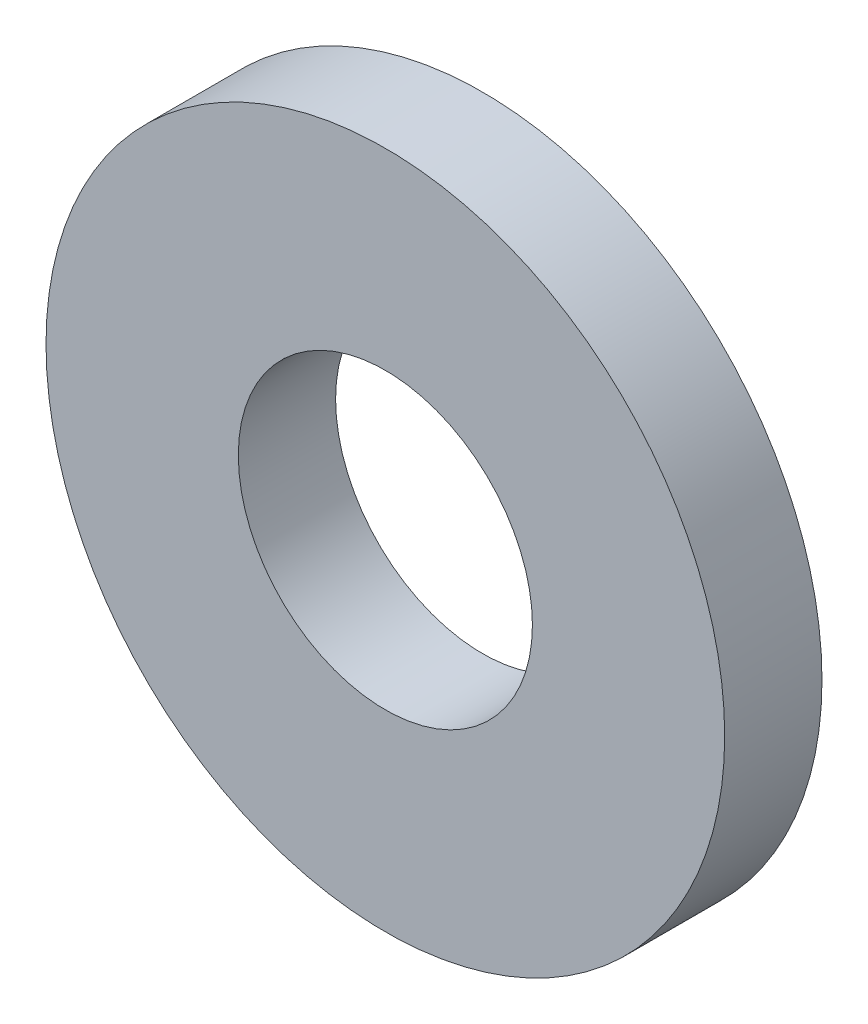
ISO-10303-21;
HEADER;
FILE_DESCRIPTION(('STEP AP214'),'2;1');
FILE_NAME('part.step','',(''),(''),'','','');
FILE_SCHEMA(('AUTOMOTIVE_DESIGN { 1 0 10303 214 1 1 1 1 }'));
ENDSEC;
DATA;
#1=APPLICATION_CONTEXT('core data for automotive mechanical design processes');
#2=APPLICATION_PROTOCOL_DEFINITION('international standard','automotive_design',2000,#1);
#3=PRODUCT_CONTEXT('',#1,'mechanical');
#4=PRODUCT('Part','Part','',(#3));
#5=PRODUCT_RELATED_PRODUCT_CATEGORY('part','',(#4));
#6=PRODUCT_DEFINITION_FORMATION('','',#4);
#7=PRODUCT_DEFINITION_CONTEXT('part definition',#1,'design');
#8=PRODUCT_DEFINITION('design','',#6,#7);
#9=PRODUCT_DEFINITION_SHAPE('','',#8);
#10=(LENGTH_UNIT() NAMED_UNIT(*) SI_UNIT(.MILLI.,.METRE.));
#11=(NAMED_UNIT(*) PLANE_ANGLE_UNIT() SI_UNIT($,.RADIAN.));
#12=(NAMED_UNIT(*) SI_UNIT($,.STERADIAN.) SOLID_ANGLE_UNIT());
#13=UNCERTAINTY_MEASURE_WITH_UNIT(LENGTH_MEASURE(1.E-05),#10,'distance_accuracy_value','');
#14=(GEOMETRIC_REPRESENTATION_CONTEXT(3) GLOBAL_UNCERTAINTY_ASSIGNED_CONTEXT((#13)) GLOBAL_UNIT_ASSIGNED_CONTEXT((#10,
#11,#12)) REPRESENTATION_CONTEXT('',''));
#15=CARTESIAN_POINT('',(0.,0.,0.));
#16=DIRECTION('',(0.,0.,1.));
#17=DIRECTION('',(1.,0.,0.));
#18=AXIS2_PLACEMENT_3D('',#15,#16,#17);
#19=CARTESIAN_POINT('',(0.,0.,1.0922));
#20=DIRECTION('',(0.,0.,1.));
#21=DIRECTION('',(1.,0.,0.));
#22=AXIS2_PLACEMENT_3D('',#19,#20,#21);
#23=PLANE('',#22);
#24=CARTESIAN_POINT('',(0.,0.,1.0922));
#25=DIRECTION('',(0.,0.,1.));
#26=DIRECTION('',(1.,0.,0.));
#27=AXIS2_PLACEMENT_3D('',#24,#25,#26);
#28=CIRCLE('',#27,3.81);
#29=CARTESIAN_POINT('',(3.81,0.,1.0922));
#30=VERTEX_POINT('',#29);
#31=EDGE_CURVE('E10',#30,#30,#28,.T.);
#32=ORIENTED_EDGE('',*,*,#31,.T.);
#33=EDGE_LOOP('',(#32));
#34=FACE_BOUND('',#33,.T.);
#35=CARTESIAN_POINT('',(0.,0.,1.0922));
#36=DIRECTION('',(0.,0.,1.));
#37=DIRECTION('',(1.,0.,0.));
#38=AXIS2_PLACEMENT_3D('',#35,#36,#37);
#39=CIRCLE('',#38,1.651);
#40=CARTESIAN_POINT('',(1.651,0.,1.0922));
#41=VERTEX_POINT('',#40);
#42=EDGE_CURVE('E41',#41,#41,#39,.T.);
#43=ORIENTED_EDGE('',*,*,#42,.F.);
#44=EDGE_LOOP('',(#43));
#45=FACE_BOUND('',#44,.T.);
#46=ADVANCED_FACE('F30',(#34,#45),#23,.T.);
#47=CARTESIAN_POINT('',(0.,0.,0.));
#48=DIRECTION('',(0.,0.,1.));
#49=DIRECTION('',(1.,0.,0.));
#50=AXIS2_PLACEMENT_3D('',#47,#48,#49);
#51=PLANE('',#50);
#52=CARTESIAN_POINT('',(0.,0.,0.));
#53=DIRECTION('',(0.,0.,1.));
#54=DIRECTION('',(1.,0.,0.));
#55=AXIS2_PLACEMENT_3D('',#52,#53,#54);
#56=CIRCLE('',#55,3.81);
#57=CARTESIAN_POINT('',(3.81,0.,0.));
#58=VERTEX_POINT('',#57);
#59=EDGE_CURVE('E34',#58,#58,#56,.T.);
#60=ORIENTED_EDGE('',*,*,#59,.F.);
#61=EDGE_LOOP('',(#60));
#62=FACE_BOUND('',#61,.T.);
#63=CARTESIAN_POINT('',(0.,0.,0.));
#64=DIRECTION('',(0.,0.,1.));
#65=DIRECTION('',(1.,0.,0.));
#66=AXIS2_PLACEMENT_3D('',#63,#64,#65);
#67=CIRCLE('',#66,1.651);
#68=CARTESIAN_POINT('',(1.651,0.,0.));
#69=VERTEX_POINT('',#68);
#70=EDGE_CURVE('E43',#69,#69,#67,.T.);
#71=ORIENTED_EDGE('',*,*,#70,.T.);
#72=EDGE_LOOP('',(#71));
#73=FACE_BOUND('',#72,.T.);
#74=ADVANCED_FACE('F53',(#62,#73),#51,.F.);
#75=CARTESIAN_POINT('',(0.,0.,1.0922));
#76=DIRECTION('',(0.,0.,-1.));
#77=DIRECTION('',(-1.,0.,0.));
#78=AXIS2_PLACEMENT_3D('',#75,#76,#77);
#79=CYLINDRICAL_SURFACE('',#78,3.81);
#80=ORIENTED_EDGE('',*,*,#31,.F.);
#81=EDGE_LOOP('',(#80));
#82=FACE_BOUND('',#81,.T.);
#83=ORIENTED_EDGE('',*,*,#59,.T.);
#84=EDGE_LOOP('',(#83));
#85=FACE_BOUND('',#84,.T.);
#86=ADVANCED_FACE('F32',(#82,#85),#79,.T.);
#87=CARTESIAN_POINT('',(0.,0.,1.0922));
#88=DIRECTION('',(0.,0.,-1.));
#89=DIRECTION('',(-1.,0.,0.));
#90=AXIS2_PLACEMENT_3D('',#87,#88,#89);
#91=CYLINDRICAL_SURFACE('',#90,1.651);
#92=ORIENTED_EDGE('',*,*,#42,.T.);
#93=EDGE_LOOP('',(#92));
#94=FACE_BOUND('',#93,.T.);
#95=ORIENTED_EDGE('',*,*,#70,.F.);
#96=EDGE_LOOP('',(#95));
#97=FACE_BOUND('',#96,.T.);
#98=ADVANCED_FACE('F49',(#94,#97),#91,.F.);
#99=CLOSED_SHELL('',(#46,#74,#86,#98));
#100=MANIFOLD_SOLID_BREP('B2',#99);
#101=ADVANCED_BREP_SHAPE_REPRESENTATION('',(#18,#100),#14);
#102=SHAPE_DEFINITION_REPRESENTATION(#9,#101);
ENDSEC;
END-ISO-10303-21;
